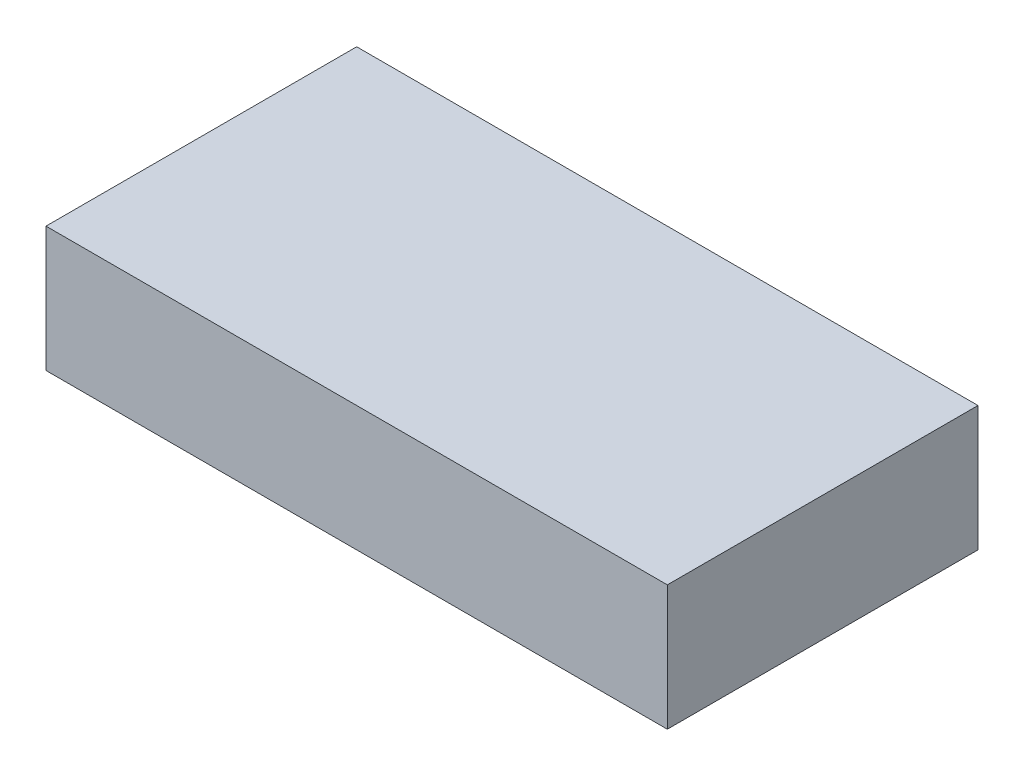
ISO-10303-21;
HEADER;
FILE_DESCRIPTION(('STEP AP214'),'2;1');
FILE_NAME('part.step','',(''),(''),'','','');
FILE_SCHEMA(('AUTOMOTIVE_DESIGN { 1 0 10303 214 1 1 1 1 }'));
ENDSEC;
DATA;
#1=APPLICATION_CONTEXT('core data for automotive mechanical design processes');
#2=APPLICATION_PROTOCOL_DEFINITION('international standard','automotive_design',2000,#1);
#3=PRODUCT_CONTEXT('',#1,'mechanical');
#4=PRODUCT('Part','Part','',(#3));
#5=PRODUCT_RELATED_PRODUCT_CATEGORY('part','',(#4));
#6=PRODUCT_DEFINITION_FORMATION('','',#4);
#7=PRODUCT_DEFINITION_CONTEXT('part definition',#1,'design');
#8=PRODUCT_DEFINITION('design','',#6,#7);
#9=PRODUCT_DEFINITION_SHAPE('','',#8);
#10=(LENGTH_UNIT() NAMED_UNIT(*) SI_UNIT(.MILLI.,.METRE.));
#11=(NAMED_UNIT(*) PLANE_ANGLE_UNIT() SI_UNIT($,.RADIAN.));
#12=(NAMED_UNIT(*) SI_UNIT($,.STERADIAN.) SOLID_ANGLE_UNIT());
#13=UNCERTAINTY_MEASURE_WITH_UNIT(LENGTH_MEASURE(1.E-05),#10,'distance_accuracy_value','');
#14=(GEOMETRIC_REPRESENTATION_CONTEXT(3) GLOBAL_UNCERTAINTY_ASSIGNED_CONTEXT((#13)) GLOBAL_UNIT_ASSIGNED_CONTEXT((#10,
#11,#12)) REPRESENTATION_CONTEXT('',''));
#15=CARTESIAN_POINT('',(0.,0.,0.));
#16=DIRECTION('',(0.,0.,1.));
#17=DIRECTION('',(1.,0.,0.));
#18=AXIS2_PLACEMENT_3D('',#15,#16,#17);
#19=CARTESIAN_POINT('',(7.95000000000002,3.2,-3.97500000000001));
#20=DIRECTION('',(-1.,0.,0.));
#21=DIRECTION('',(0.,0.,1.));
#22=AXIS2_PLACEMENT_3D('',#19,#20,#21);
#23=PLANE('',#22);
#24=DIRECTION('',(0.,0.,-1.));
#25=VECTOR('',#24,1.);
#26=CARTESIAN_POINT('',(7.95000000000002,0.,-3.97500000000001));
#27=LINE('',#26,#25);
#28=CARTESIAN_POINT('',(7.95000000000002,0.,3.97500000000001));
#29=VERTEX_POINT('',#28);
#30=CARTESIAN_POINT('',(7.95000000000002,0.,-3.97500000000001));
#31=VERTEX_POINT('',#30);
#32=EDGE_CURVE('E130',#29,#31,#27,.T.);
#33=ORIENTED_EDGE('',*,*,#32,.T.);
#34=DIRECTION('',(0.,-1.,0.));
#35=VECTOR('',#34,1.);
#36=CARTESIAN_POINT('',(7.95000000000002,3.2,-3.97500000000001));
#37=LINE('',#36,#35);
#38=CARTESIAN_POINT('',(7.95000000000002,3.2,-3.97500000000001));
#39=VERTEX_POINT('',#38);
#40=EDGE_CURVE('E11',#39,#31,#37,.T.);
#41=ORIENTED_EDGE('',*,*,#40,.F.);
#42=DIRECTION('',(0.,0.,-1.));
#43=VECTOR('',#42,1.);
#44=CARTESIAN_POINT('',(7.95000000000002,3.2,-3.97500000000001));
#45=LINE('',#44,#43);
#46=CARTESIAN_POINT('',(7.95000000000002,3.2,3.97500000000001));
#47=VERTEX_POINT('',#46);
#48=EDGE_CURVE('E150',#47,#39,#45,.T.);
#49=ORIENTED_EDGE('',*,*,#48,.F.);
#50=DIRECTION('',(0.,-1.,0.));
#51=VECTOR('',#50,1.);
#52=CARTESIAN_POINT('',(7.95000000000002,3.2,3.97500000000001));
#53=LINE('',#52,#51);
#54=EDGE_CURVE('E155',#47,#29,#53,.T.);
#55=ORIENTED_EDGE('',*,*,#54,.T.);
#56=EDGE_LOOP('',(#33,#41,#49,#55));
#57=FACE_BOUND('',#56,.T.);
#58=ADVANCED_FACE('F34',(#57),#23,.F.);
#59=CARTESIAN_POINT('',(-7.94999999999998,3.2,-3.97500000000001));
#60=DIRECTION('',(0.,0.,1.));
#61=DIRECTION('',(1.,0.,0.));
#62=AXIS2_PLACEMENT_3D('',#59,#60,#61);
#63=PLANE('',#62);
#64=DIRECTION('',(-1.,0.,0.));
#65=VECTOR('',#64,1.);
#66=CARTESIAN_POINT('',(-7.94999999999998,0.,-3.97500000000001));
#67=LINE('',#66,#65);
#68=CARTESIAN_POINT('',(-7.94999999999998,0.,-3.97500000000001));
#69=VERTEX_POINT('',#68);
#70=EDGE_CURVE('E134',#31,#69,#67,.T.);
#71=ORIENTED_EDGE('',*,*,#70,.T.);
#72=DIRECTION('',(0.,-1.,0.));
#73=VECTOR('',#72,1.);
#74=CARTESIAN_POINT('',(-7.94999999999998,3.2,-3.97500000000001));
#75=LINE('',#74,#73);
#76=CARTESIAN_POINT('',(-7.94999999999998,3.2,-3.97500000000001));
#77=VERTEX_POINT('',#76);
#78=EDGE_CURVE('E41',#77,#69,#75,.T.);
#79=ORIENTED_EDGE('',*,*,#78,.F.);
#80=DIRECTION('',(-1.,0.,0.));
#81=VECTOR('',#80,1.);
#82=CARTESIAN_POINT('',(-7.94999999999998,3.2,-3.97500000000001));
#83=LINE('',#82,#81);
#84=EDGE_CURVE('E85',#39,#77,#83,.T.);
#85=ORIENTED_EDGE('',*,*,#84,.F.);
#86=ORIENTED_EDGE('',*,*,#40,.T.);
#87=EDGE_LOOP('',(#71,#79,#85,#86));
#88=FACE_BOUND('',#87,.T.);
#89=ADVANCED_FACE('F184',(#88),#63,.F.);
#90=CARTESIAN_POINT('',(-7.94999999999998,3.2,-3.97500000000001));
#91=DIRECTION('',(1.,0.,0.));
#92=DIRECTION('',(0.,0.,-1.));
#93=AXIS2_PLACEMENT_3D('',#90,#91,#92);
#94=PLANE('',#93);
#95=DIRECTION('',(0.,0.,1.));
#96=VECTOR('',#95,1.);
#97=CARTESIAN_POINT('',(-7.94999999999998,0.,-3.97500000000001));
#98=LINE('',#97,#96);
#99=CARTESIAN_POINT('',(-7.94999999999998,0.,3.97500000000001));
#100=VERTEX_POINT('',#99);
#101=EDGE_CURVE('E158',#69,#100,#98,.T.);
#102=ORIENTED_EDGE('',*,*,#101,.T.);
#103=DIRECTION('',(0.,-1.,0.));
#104=VECTOR('',#103,1.);
#105=CARTESIAN_POINT('',(-7.94999999999998,3.2,3.97500000000001));
#106=LINE('',#105,#104);
#107=CARTESIAN_POINT('',(-7.94999999999998,3.2,3.97500000000001));
#108=VERTEX_POINT('',#107);
#109=EDGE_CURVE('E162',#108,#100,#106,.T.);
#110=ORIENTED_EDGE('',*,*,#109,.F.);
#111=DIRECTION('',(0.,0.,1.));
#112=VECTOR('',#111,1.);
#113=CARTESIAN_POINT('',(-7.94999999999998,3.2,-3.97500000000001));
#114=LINE('',#113,#112);
#115=EDGE_CURVE('E153',#77,#108,#114,.T.);
#116=ORIENTED_EDGE('',*,*,#115,.F.);
#117=ORIENTED_EDGE('',*,*,#78,.T.);
#118=EDGE_LOOP('',(#102,#110,#116,#117));
#119=FACE_BOUND('',#118,.T.);
#120=ADVANCED_FACE('F167',(#119),#94,.F.);
#121=CARTESIAN_POINT('',(-7.94999999999998,3.2,3.97500000000001));
#122=DIRECTION('',(0.,0.,-1.));
#123=DIRECTION('',(-1.,0.,0.));
#124=AXIS2_PLACEMENT_3D('',#121,#122,#123);
#125=PLANE('',#124);
#126=DIRECTION('',(1.,0.,0.));
#127=VECTOR('',#126,1.);
#128=CARTESIAN_POINT('',(-7.94999999999998,0.,3.97500000000001));
#129=LINE('',#128,#127);
#130=EDGE_CURVE('E78',#100,#29,#129,.T.);
#131=ORIENTED_EDGE('',*,*,#130,.T.);
#132=ORIENTED_EDGE('',*,*,#54,.F.);
#133=DIRECTION('',(1.,0.,0.));
#134=VECTOR('',#133,1.);
#135=CARTESIAN_POINT('',(-7.94999999999998,3.2,3.97500000000001));
#136=LINE('',#135,#134);
#137=EDGE_CURVE('E57',#108,#47,#136,.T.);
#138=ORIENTED_EDGE('',*,*,#137,.F.);
#139=ORIENTED_EDGE('',*,*,#109,.T.);
#140=EDGE_LOOP('',(#131,#132,#138,#139));
#141=FACE_BOUND('',#140,.T.);
#142=ADVANCED_FACE('F175',(#141),#125,.F.);
#143=CARTESIAN_POINT('',(0.,3.2,0.));
#144=DIRECTION('',(0.,1.,0.));
#145=DIRECTION('',(0.,0.,1.));
#146=AXIS2_PLACEMENT_3D('',#143,#144,#145);
#147=PLANE('',#146);
#148=ORIENTED_EDGE('',*,*,#48,.T.);
#149=ORIENTED_EDGE('',*,*,#84,.T.);
#150=ORIENTED_EDGE('',*,*,#115,.T.);
#151=ORIENTED_EDGE('',*,*,#137,.T.);
#152=EDGE_LOOP('',(#148,#149,#150,#151));
#153=FACE_BOUND('',#152,.T.);
#154=ADVANCED_FACE('F177',(#153),#147,.T.);
#155=CARTESIAN_POINT('',(0.,0.,0.));
#156=DIRECTION('',(0.,1.,0.));
#157=DIRECTION('',(0.,0.,1.));
#158=AXIS2_PLACEMENT_3D('',#155,#156,#157);
#159=PLANE('',#158);
#160=DIRECTION('',(1.,0.,0.));
#161=VECTOR('',#160,1.);
#162=CARTESIAN_POINT('',(-7.94999999999998,0.,2.77500000000001));
#163=LINE('',#162,#161);
#164=CARTESIAN_POINT('',(-6.74999999999998,0.,2.77500000000001));
#165=VERTEX_POINT('',#164);
#166=CARTESIAN_POINT('',(6.75000000000002,0.,2.77500000000001));
#167=VERTEX_POINT('',#166);
#168=EDGE_CURVE('E125',#165,#167,#163,.T.);
#169=ORIENTED_EDGE('',*,*,#168,.T.);
#170=DIRECTION('',(0.,0.,-1.));
#171=VECTOR('',#170,1.);
#172=CARTESIAN_POINT('',(6.75000000000002,0.,-3.97500000000001));
#173=LINE('',#172,#171);
#174=CARTESIAN_POINT('',(6.75000000000002,0.,-2.77500000000001));
#175=VERTEX_POINT('',#174);
#176=EDGE_CURVE('E144',#167,#175,#173,.T.);
#177=ORIENTED_EDGE('',*,*,#176,.T.);
#178=DIRECTION('',(-1.,0.,0.));
#179=VECTOR('',#178,1.);
#180=CARTESIAN_POINT('',(-7.94999999999998,0.,-2.77500000000001));
#181=LINE('',#180,#179);
#182=CARTESIAN_POINT('',(-6.74999999999998,0.,-2.77500000000001));
#183=VERTEX_POINT('',#182);
#184=EDGE_CURVE('E129',#175,#183,#181,.T.);
#185=ORIENTED_EDGE('',*,*,#184,.T.);
#186=DIRECTION('',(0.,0.,1.));
#187=VECTOR('',#186,1.);
#188=CARTESIAN_POINT('',(-6.74999999999998,0.,-3.97500000000001));
#189=LINE('',#188,#187);
#190=EDGE_CURVE('E48',#183,#165,#189,.T.);
#191=ORIENTED_EDGE('',*,*,#190,.T.);
#192=EDGE_LOOP('',(#169,#177,#185,#191));
#193=FACE_BOUND('',#192,.T.);
#194=ORIENTED_EDGE('',*,*,#32,.F.);
#195=ORIENTED_EDGE('',*,*,#130,.F.);
#196=ORIENTED_EDGE('',*,*,#101,.F.);
#197=ORIENTED_EDGE('',*,*,#70,.F.);
#198=EDGE_LOOP('',(#194,#195,#196,#197));
#199=FACE_BOUND('',#198,.T.);
#200=ADVANCED_FACE('F171',(#193,#199),#159,.F.);
#201=CARTESIAN_POINT('',(6.75000000000002,3.2,-3.97500000000001));
#202=DIRECTION('',(-1.,0.,0.));
#203=DIRECTION('',(0.,0.,1.));
#204=AXIS2_PLACEMENT_3D('',#201,#202,#203);
#205=PLANE('',#204);
#206=ORIENTED_EDGE('',*,*,#176,.F.);
#207=DIRECTION('',(0.,-1.,0.));
#208=VECTOR('',#207,1.);
#209=CARTESIAN_POINT('',(6.75000000000002,3.2,2.77500000000001));
#210=LINE('',#209,#208);
#211=CARTESIAN_POINT('',(6.75000000000002,2.,2.77500000000001));
#212=VERTEX_POINT('',#211);
#213=EDGE_CURVE('E124',#212,#167,#210,.T.);
#214=ORIENTED_EDGE('',*,*,#213,.F.);
#215=DIRECTION('',(0.,0.,-1.));
#216=VECTOR('',#215,1.);
#217=CARTESIAN_POINT('',(6.75000000000002,2.,-3.97500000000001));
#218=LINE('',#217,#216);
#219=CARTESIAN_POINT('',(6.75000000000002,2.,-2.77500000000001));
#220=VERTEX_POINT('',#219);
#221=EDGE_CURVE('E112',#212,#220,#218,.T.);
#222=ORIENTED_EDGE('',*,*,#221,.T.);
#223=DIRECTION('',(0.,-1.,0.));
#224=VECTOR('',#223,1.);
#225=CARTESIAN_POINT('',(6.75000000000002,3.2,-2.77500000000001));
#226=LINE('',#225,#224);
#227=EDGE_CURVE('E122',#220,#175,#226,.T.);
#228=ORIENTED_EDGE('',*,*,#227,.T.);
#229=EDGE_LOOP('',(#206,#214,#222,#228));
#230=FACE_BOUND('',#229,.T.);
#231=ADVANCED_FACE('F121',(#230),#205,.T.);
#232=CARTESIAN_POINT('',(-7.94999999999998,3.2,-2.77500000000001));
#233=DIRECTION('',(0.,0.,1.));
#234=DIRECTION('',(1.,0.,0.));
#235=AXIS2_PLACEMENT_3D('',#232,#233,#234);
#236=PLANE('',#235);
#237=ORIENTED_EDGE('',*,*,#184,.F.);
#238=ORIENTED_EDGE('',*,*,#227,.F.);
#239=DIRECTION('',(-1.,0.,0.));
#240=VECTOR('',#239,1.);
#241=CARTESIAN_POINT('',(-7.94999999999998,2.,-2.77500000000001));
#242=LINE('',#241,#240);
#243=CARTESIAN_POINT('',(-6.74999999999998,2.,-2.77500000000001));
#244=VERTEX_POINT('',#243);
#245=EDGE_CURVE('E108',#220,#244,#242,.T.);
#246=ORIENTED_EDGE('',*,*,#245,.T.);
#247=DIRECTION('',(0.,-1.,0.));
#248=VECTOR('',#247,1.);
#249=CARTESIAN_POINT('',(-6.74999999999998,3.2,-2.77500000000001));
#250=LINE('',#249,#248);
#251=EDGE_CURVE('E131',#244,#183,#250,.T.);
#252=ORIENTED_EDGE('',*,*,#251,.T.);
#253=EDGE_LOOP('',(#237,#238,#246,#252));
#254=FACE_BOUND('',#253,.T.);
#255=ADVANCED_FACE('F127',(#254),#236,.T.);
#256=CARTESIAN_POINT('',(-6.74999999999998,3.2,-3.97500000000001));
#257=DIRECTION('',(1.,0.,0.));
#258=DIRECTION('',(0.,0.,-1.));
#259=AXIS2_PLACEMENT_3D('',#256,#257,#258);
#260=PLANE('',#259);
#261=ORIENTED_EDGE('',*,*,#190,.F.);
#262=ORIENTED_EDGE('',*,*,#251,.F.);
#263=DIRECTION('',(0.,0.,1.));
#264=VECTOR('',#263,1.);
#265=CARTESIAN_POINT('',(-6.74999999999998,2.,-3.97500000000001));
#266=LINE('',#265,#264);
#267=CARTESIAN_POINT('',(-6.74999999999998,2.,2.77500000000001));
#268=VERTEX_POINT('',#267);
#269=EDGE_CURVE('E113',#244,#268,#266,.T.);
#270=ORIENTED_EDGE('',*,*,#269,.T.);
#271=DIRECTION('',(0.,-1.,0.));
#272=VECTOR('',#271,1.);
#273=CARTESIAN_POINT('',(-6.74999999999998,3.2,2.77500000000001));
#274=LINE('',#273,#272);
#275=EDGE_CURVE('E136',#268,#165,#274,.T.);
#276=ORIENTED_EDGE('',*,*,#275,.T.);
#277=EDGE_LOOP('',(#261,#262,#270,#276));
#278=FACE_BOUND('',#277,.T.);
#279=ADVANCED_FACE('F232',(#278),#260,.T.);
#280=CARTESIAN_POINT('',(-7.94999999999998,3.2,2.77500000000001));
#281=DIRECTION('',(0.,0.,-1.));
#282=DIRECTION('',(-1.,0.,0.));
#283=AXIS2_PLACEMENT_3D('',#280,#281,#282);
#284=PLANE('',#283);
#285=ORIENTED_EDGE('',*,*,#168,.F.);
#286=ORIENTED_EDGE('',*,*,#275,.F.);
#287=DIRECTION('',(1.,0.,0.));
#288=VECTOR('',#287,1.);
#289=CARTESIAN_POINT('',(-7.94999999999998,2.,2.77500000000001));
#290=LINE('',#289,#288);
#291=EDGE_CURVE('E139',#268,#212,#290,.T.);
#292=ORIENTED_EDGE('',*,*,#291,.T.);
#293=ORIENTED_EDGE('',*,*,#213,.T.);
#294=EDGE_LOOP('',(#285,#286,#292,#293));
#295=FACE_BOUND('',#294,.T.);
#296=ADVANCED_FACE('F241',(#295),#284,.T.);
#297=CARTESIAN_POINT('',(0.,2.,0.));
#298=DIRECTION('',(0.,1.,0.));
#299=DIRECTION('',(0.,0.,1.));
#300=AXIS2_PLACEMENT_3D('',#297,#298,#299);
#301=PLANE('',#300);
#302=ORIENTED_EDGE('',*,*,#221,.F.);
#303=ORIENTED_EDGE('',*,*,#291,.F.);
#304=ORIENTED_EDGE('',*,*,#269,.F.);
#305=ORIENTED_EDGE('',*,*,#245,.F.);
#306=EDGE_LOOP('',(#302,#303,#304,#305));
#307=FACE_BOUND('',#306,.T.);
#308=ADVANCED_FACE('F110',(#307),#301,.F.);
#309=CLOSED_SHELL('',(#58,#89,#120,#142,#154,#200,#231,#255,#279,#296,#308));
#310=MANIFOLD_SOLID_BREP('B2',#309);
#311=ADVANCED_BREP_SHAPE_REPRESENTATION('',(#18,#310),#14);
#312=SHAPE_DEFINITION_REPRESENTATION(#9,#311);
ENDSEC;
END-ISO-10303-21;
